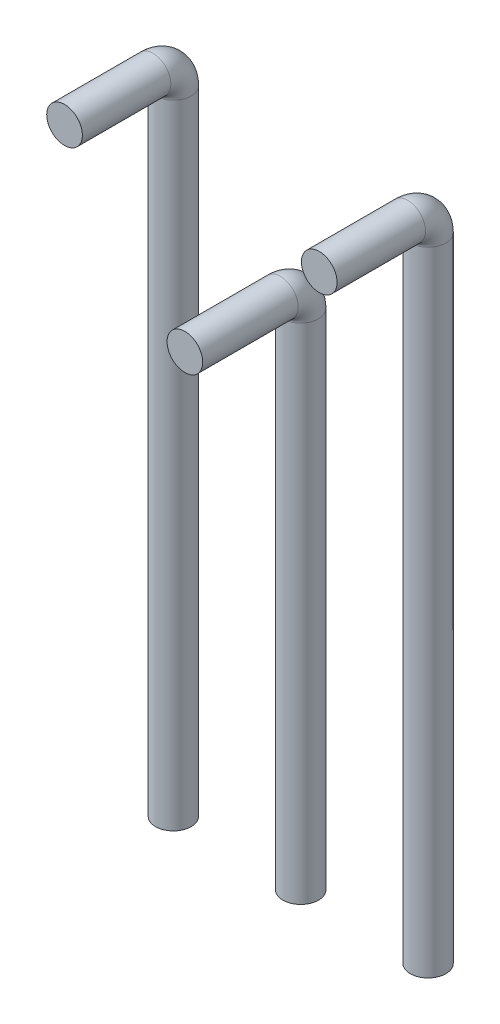
ISO-10303-21;
HEADER;
FILE_DESCRIPTION(('STEP AP214'),'2;1');
FILE_NAME('part.step','',(''),(''),'','','');
FILE_SCHEMA(('AUTOMOTIVE_DESIGN { 1 0 10303 214 1 1 1 1 }'));
ENDSEC;
DATA;
#1=APPLICATION_CONTEXT('core data for automotive mechanical design processes');
#2=APPLICATION_PROTOCOL_DEFINITION('international standard','automotive_design',2000,#1);
#3=PRODUCT_CONTEXT('',#1,'mechanical');
#4=PRODUCT('Part','Part','',(#3));
#5=PRODUCT_RELATED_PRODUCT_CATEGORY('part','',(#4));
#6=PRODUCT_DEFINITION_FORMATION('','',#4);
#7=PRODUCT_DEFINITION_CONTEXT('part definition',#1,'design');
#8=PRODUCT_DEFINITION('design','',#6,#7);
#9=PRODUCT_DEFINITION_SHAPE('','',#8);
#10=(LENGTH_UNIT() NAMED_UNIT(*) SI_UNIT(.MILLI.,.METRE.));
#11=(NAMED_UNIT(*) PLANE_ANGLE_UNIT() SI_UNIT($,.RADIAN.));
#12=(NAMED_UNIT(*) SI_UNIT($,.STERADIAN.) SOLID_ANGLE_UNIT());
#13=UNCERTAINTY_MEASURE_WITH_UNIT(LENGTH_MEASURE(1.E-05),#10,'distance_accuracy_value','');
#14=(GEOMETRIC_REPRESENTATION_CONTEXT(3) GLOBAL_UNCERTAINTY_ASSIGNED_CONTEXT((#13)) GLOBAL_UNIT_ASSIGNED_CONTEXT((#10,
#11,#12)) REPRESENTATION_CONTEXT('',''));
#15=CARTESIAN_POINT('',(0.,0.,0.));
#16=DIRECTION('',(0.,0.,1.));
#17=DIRECTION('',(1.,0.,0.));
#18=AXIS2_PLACEMENT_3D('',#15,#16,#17);
#19=CARTESIAN_POINT('',(6.86201683385187,10.2829242955665,7.09877555641469));
#20=DIRECTION('',(0.,0.,1.));
#21=DIRECTION('',(0.,-1.,0.));
#22=AXIS2_PLACEMENT_3D('',#19,#20,#21);
#23=PLANE('',#22);
#24=CARTESIAN_POINT('',(6.86201683385187,10.2829242955665,7.09877555641469));
#25=DIRECTION('',(0.,0.,1.));
#26=DIRECTION('',(1.,0.,0.));
#27=AXIS2_PLACEMENT_3D('',#24,#25,#26);
#28=CIRCLE('',#27,0.35);
#29=CARTESIAN_POINT('',(7.21201683385187,10.2829242955665,7.09877555641469));
#30=VERTEX_POINT('',#29);
#31=EDGE_CURVE('P0_E18',#30,#30,#28,.F.);
#32=ORIENTED_EDGE('',*,*,#31,.F.);
#33=EDGE_LOOP('',(#32));
#34=FACE_BOUND('',#33,.T.);
#35=ADVANCED_FACE('P0_F15',(#34),#23,.T.);
#36=CARTESIAN_POINT('',(6.86201683385187,10.2829242955665,5.22439905457059));
#37=DIRECTION('',(0.,0.,1.));
#38=DIRECTION('',(1.,0.,0.));
#39=AXIS2_PLACEMENT_3D('',#36,#37,#38);
#40=CYLINDRICAL_SURFACE('',#39,0.35);
#41=CARTESIAN_POINT('',(6.86201683385187,10.2829242955665,5.22439905457059));
#42=DIRECTION('',(0.,0.,1.));
#43=DIRECTION('',(0.,1.,0.));
#44=AXIS2_PLACEMENT_3D('',#41,#42,#43);
#45=CIRCLE('',#44,0.35);
#46=CARTESIAN_POINT('',(6.86201683385187,10.6329242955665,5.22439905457059));
#47=VERTEX_POINT('',#46);
#48=EDGE_CURVE('P0_E26',#47,#47,#45,.F.);
#49=ORIENTED_EDGE('',*,*,#48,.F.);
#50=EDGE_LOOP('',(#49));
#51=FACE_BOUND('',#50,.T.);
#52=ORIENTED_EDGE('',*,*,#31,.T.);
#53=EDGE_LOOP('',(#52));
#54=FACE_BOUND('',#53,.T.);
#55=ADVANCED_FACE('P0_F37',(#51,#54),#40,.T.);
#56=CARTESIAN_POINT('',(6.86201683385187,9.88292429556653,5.22439905457059));
#57=DIRECTION('',(1.,0.,0.));
#58=DIRECTION('',(0.,0.,-1.));
#59=AXIS2_PLACEMENT_3D('',#56,#57,#58);
#60=TOROIDAL_SURFACE('',#59,0.4,0.35);
#61=ORIENTED_EDGE('',*,*,#48,.T.);
#62=EDGE_LOOP('',(#61));
#63=FACE_BOUND('',#62,.T.);
#64=CARTESIAN_POINT('',(6.86201683385187,9.88292429556652,4.82439905457059));
#65=DIRECTION('',(0.,-1.,0.));
#66=DIRECTION('',(0.,0.,-1.));
#67=AXIS2_PLACEMENT_3D('',#64,#65,#66);
#68=CIRCLE('',#67,0.35);
#69=CARTESIAN_POINT('',(6.86201683385187,9.88292429556652,4.47439905457059));
#70=VERTEX_POINT('',#69);
#71=EDGE_CURVE('P0_E22',#70,#70,#68,.T.);
#72=ORIENTED_EDGE('',*,*,#71,.F.);
#73=EDGE_LOOP('',(#72));
#74=FACE_BOUND('',#73,.T.);
#75=ADVANCED_FACE('P0_F33',(#63,#74),#60,.T.);
#76=CARTESIAN_POINT('',(6.86201683385187,0.,4.82439905457059));
#77=DIRECTION('',(0.,1.,0.));
#78=DIRECTION('',(0.,0.,1.));
#79=AXIS2_PLACEMENT_3D('',#76,#77,#78);
#80=PLANE('',#79);
#81=CARTESIAN_POINT('',(6.86201683385187,0.,4.82439905457059));
#82=DIRECTION('',(0.,-1.,0.));
#83=DIRECTION('',(0.,0.,-1.));
#84=AXIS2_PLACEMENT_3D('',#81,#82,#83);
#85=CIRCLE('',#84,0.35);
#86=CARTESIAN_POINT('',(6.86201683385187,0.,4.47439905457059));
#87=VERTEX_POINT('',#86);
#88=EDGE_CURVE('P0_E10',#87,#87,#85,.F.);
#89=ORIENTED_EDGE('',*,*,#88,.F.);
#90=EDGE_LOOP('',(#89));
#91=FACE_BOUND('',#90,.T.);
#92=ADVANCED_FACE('P0_F36',(#91),#80,.F.);
#93=CARTESIAN_POINT('',(6.86201683385187,4.91650867562043,4.82439905457059));
#94=DIRECTION('',(0.,-1.,0.));
#95=DIRECTION('',(0.,0.,-1.));
#96=AXIS2_PLACEMENT_3D('',#93,#94,#95);
#97=CYLINDRICAL_SURFACE('',#96,0.35);
#98=ORIENTED_EDGE('',*,*,#88,.T.);
#99=EDGE_LOOP('',(#98));
#100=FACE_BOUND('',#99,.T.);
#101=ORIENTED_EDGE('',*,*,#71,.T.);
#102=EDGE_LOOP('',(#101));
#103=FACE_BOUND('',#102,.T.);
#104=ADVANCED_FACE('P0_F49',(#100,#103),#97,.T.);
#105=CLOSED_SHELL('',(#35,#55,#75,#92,#104));
#106=MANIFOLD_SOLID_BREP('P0_B1',#105);
#107=CARTESIAN_POINT('',(4.36201683385183,12.8229242955666,6.96081396231212));
#108=DIRECTION('',(0.,0.,1.));
#109=DIRECTION('',(0.,-1.,0.));
#110=AXIS2_PLACEMENT_3D('',#107,#108,#109);
#111=PLANE('',#110);
#112=CARTESIAN_POINT('',(4.36201683385183,12.8229242955666,6.96081396231212));
#113=DIRECTION('',(0.,0.,1.));
#114=DIRECTION('',(0.,-1.,0.));
#115=AXIS2_PLACEMENT_3D('',#112,#113,#114);
#116=CIRCLE('',#115,0.35);
#117=CARTESIAN_POINT('',(4.36201683385183,12.4729242955666,6.96081396231212));
#118=VERTEX_POINT('',#117);
#119=EDGE_CURVE('P1_E18',#118,#118,#116,.F.);
#120=ORIENTED_EDGE('',*,*,#119,.F.);
#121=EDGE_LOOP('',(#120));
#122=FACE_BOUND('',#121,.T.);
#123=ADVANCED_FACE('P1_F15',(#122),#111,.T.);
#124=CARTESIAN_POINT('',(4.36201683385183,12.8229242955665,5.22439905457058));
#125=DIRECTION('',(0.,0.,1.));
#126=DIRECTION('',(0.,-1.,0.));
#127=AXIS2_PLACEMENT_3D('',#124,#125,#126);
#128=CYLINDRICAL_SURFACE('',#127,0.35);
#129=ORIENTED_EDGE('',*,*,#119,.T.);
#130=EDGE_LOOP('',(#129));
#131=FACE_BOUND('',#130,.T.);
#132=CARTESIAN_POINT('',(4.36201683385183,12.8229242955665,5.22439905457058));
#133=DIRECTION('',(0.,0.,1.));
#134=DIRECTION('',(0.,1.,0.));
#135=AXIS2_PLACEMENT_3D('',#132,#133,#134);
#136=CIRCLE('',#135,0.35);
#137=CARTESIAN_POINT('',(4.36201683385183,13.1729242955665,5.22439905457057));
#138=VERTEX_POINT('',#137);
#139=EDGE_CURVE('P1_E26',#138,#138,#136,.F.);
#140=ORIENTED_EDGE('',*,*,#139,.F.);
#141=EDGE_LOOP('',(#140));
#142=FACE_BOUND('',#141,.T.);
#143=ADVANCED_FACE('P1_F37',(#131,#142),#128,.T.);
#144=CARTESIAN_POINT('',(4.36201683385183,12.4229242955665,5.22439905457059));
#145=DIRECTION('',(1.,0.,0.));
#146=DIRECTION('',(0.,0.,-1.));
#147=AXIS2_PLACEMENT_3D('',#144,#145,#146);
#148=TOROIDAL_SURFACE('',#147,0.400000000000002,0.35);
#149=ORIENTED_EDGE('',*,*,#139,.T.);
#150=EDGE_LOOP('',(#149));
#151=FACE_BOUND('',#150,.T.);
#152=CARTESIAN_POINT('',(4.36201683385183,12.4229242955665,4.82439905457059));
#153=DIRECTION('',(0.,-1.,0.));
#154=DIRECTION('',(0.,0.,-1.));
#155=AXIS2_PLACEMENT_3D('',#152,#153,#154);
#156=CIRCLE('',#155,0.35);
#157=CARTESIAN_POINT('',(4.36201683385183,12.4229242955665,4.47439905457059));
#158=VERTEX_POINT('',#157);
#159=EDGE_CURVE('P1_E22',#158,#158,#156,.T.);
#160=ORIENTED_EDGE('',*,*,#159,.F.);
#161=EDGE_LOOP('',(#160));
#162=FACE_BOUND('',#161,.T.);
#163=ADVANCED_FACE('P1_F33',(#151,#162),#148,.T.);
#164=CARTESIAN_POINT('',(4.36201683385183,0.,4.82439905457059));
#165=DIRECTION('',(0.,1.,0.));
#166=DIRECTION('',(0.,0.,1.));
#167=AXIS2_PLACEMENT_3D('',#164,#165,#166);
#168=PLANE('',#167);
#169=CARTESIAN_POINT('',(4.36201683385183,0.,4.82439905457059));
#170=DIRECTION('',(0.,-1.,0.));
#171=DIRECTION('',(0.,0.,-1.));
#172=AXIS2_PLACEMENT_3D('',#169,#170,#171);
#173=CIRCLE('',#172,0.35);
#174=CARTESIAN_POINT('',(4.36201683385183,0.,4.47439905457059));
#175=VERTEX_POINT('',#174);
#176=EDGE_CURVE('P1_E10',#175,#175,#173,.F.);
#177=ORIENTED_EDGE('',*,*,#176,.F.);
#178=EDGE_LOOP('',(#177));
#179=FACE_BOUND('',#178,.T.);
#180=ADVANCED_FACE('P1_F36',(#179),#168,.F.);
#181=CARTESIAN_POINT('',(4.36201683385183,1.80499228054032,4.82439905457059));
#182=DIRECTION('',(0.,-1.,0.));
#183=DIRECTION('',(0.,0.,-1.));
#184=AXIS2_PLACEMENT_3D('',#181,#182,#183);
#185=CYLINDRICAL_SURFACE('',#184,0.35);
#186=ORIENTED_EDGE('',*,*,#176,.T.);
#187=EDGE_LOOP('',(#186));
#188=FACE_BOUND('',#187,.T.);
#189=ORIENTED_EDGE('',*,*,#159,.T.);
#190=EDGE_LOOP('',(#189));
#191=FACE_BOUND('',#190,.T.);
#192=ADVANCED_FACE('P1_F49',(#188,#191),#185,.T.);
#193=CLOSED_SHELL('',(#123,#143,#163,#180,#192));
#194=MANIFOLD_SOLID_BREP('P1_B1',#193);
#195=CARTESIAN_POINT('',(9.36201683385183,12.8229242955666,6.96081396231212));
#196=DIRECTION('',(0.,0.,1.));
#197=DIRECTION('',(0.,-1.,0.));
#198=AXIS2_PLACEMENT_3D('',#195,#196,#197);
#199=PLANE('',#198);
#200=CARTESIAN_POINT('',(9.36201683385183,12.8229242955666,6.96081396231212));
#201=DIRECTION('',(0.,0.,1.));
#202=DIRECTION('',(1.,0.,0.));
#203=AXIS2_PLACEMENT_3D('',#200,#201,#202);
#204=CIRCLE('',#203,0.35);
#205=CARTESIAN_POINT('',(9.71201683385183,12.8229242955666,6.96081396231212));
#206=VERTEX_POINT('',#205);
#207=EDGE_CURVE('P2_E17',#206,#206,#204,.F.);
#208=ORIENTED_EDGE('',*,*,#207,.F.);
#209=EDGE_LOOP('',(#208));
#210=FACE_BOUND('',#209,.T.);
#211=ADVANCED_FACE('P2_F14',(#210),#199,.T.);
#212=CARTESIAN_POINT('',(9.36201683385183,12.8229242955666,5.22439905457059));
#213=DIRECTION('',(0.,0.,1.));
#214=DIRECTION('',(1.,0.,0.));
#215=AXIS2_PLACEMENT_3D('',#212,#213,#214);
#216=CYLINDRICAL_SURFACE('',#215,0.35);
#217=CARTESIAN_POINT('',(9.36201683385183,12.8229242955666,5.22439905457059));
#218=DIRECTION('',(0.,0.,1.));
#219=DIRECTION('',(0.,1.,0.));
#220=AXIS2_PLACEMENT_3D('',#217,#218,#219);
#221=CIRCLE('',#220,0.349999999999999);
#222=CARTESIAN_POINT('',(9.36201683385183,13.1729242955666,5.22439905457059));
#223=VERTEX_POINT('',#222);
#224=EDGE_CURVE('P2_E25',#223,#223,#221,.F.);
#225=ORIENTED_EDGE('',*,*,#224,.F.);
#226=EDGE_LOOP('',(#225));
#227=FACE_BOUND('',#226,.T.);
#228=ORIENTED_EDGE('',*,*,#207,.T.);
#229=EDGE_LOOP('',(#228));
#230=FACE_BOUND('',#229,.T.);
#231=ADVANCED_FACE('P2_F36',(#227,#230),#216,.T.);
#232=CARTESIAN_POINT('',(9.36201683385183,12.4229242955666,5.22439905457059));
#233=DIRECTION('',(1.,0.,0.));
#234=DIRECTION('',(0.,0.,-1.));
#235=AXIS2_PLACEMENT_3D('',#232,#233,#234);
#236=TOROIDAL_SURFACE('',#235,0.399999999999999,0.349999999999999);
#237=ORIENTED_EDGE('',*,*,#224,.T.);
#238=EDGE_LOOP('',(#237));
#239=FACE_BOUND('',#238,.T.);
#240=CARTESIAN_POINT('',(9.36201683385183,12.4229242955666,4.82439905457059));
#241=DIRECTION('',(0.,-1.,0.));
#242=DIRECTION('',(0.,0.,-1.));
#243=AXIS2_PLACEMENT_3D('',#240,#241,#242);
#244=CIRCLE('',#243,0.349999999999999);
#245=CARTESIAN_POINT('',(9.36201683385183,12.4229242955666,4.47439905457059));
#246=VERTEX_POINT('',#245);
#247=EDGE_CURVE('P2_E21',#246,#246,#244,.T.);
#248=ORIENTED_EDGE('',*,*,#247,.F.);
#249=EDGE_LOOP('',(#248));
#250=FACE_BOUND('',#249,.T.);
#251=ADVANCED_FACE('P2_F32',(#239,#250),#236,.T.);
#252=CARTESIAN_POINT('',(9.36201683385183,0.,4.82439905457059));
#253=DIRECTION('',(0.,1.,0.));
#254=DIRECTION('',(0.,0.,1.));
#255=AXIS2_PLACEMENT_3D('',#252,#253,#254);
#256=PLANE('',#255);
#257=CARTESIAN_POINT('',(9.36201683385183,0.,4.82439905457059));
#258=DIRECTION('',(0.,-1.,0.));
#259=DIRECTION('',(0.,0.,-1.));
#260=AXIS2_PLACEMENT_3D('',#257,#258,#259);
#261=CIRCLE('',#260,0.349999999999999);
#262=CARTESIAN_POINT('',(9.36201683385183,0.,4.47439905457059));
#263=VERTEX_POINT('',#262);
#264=EDGE_CURVE('P2_E9',#263,#263,#261,.F.);
#265=ORIENTED_EDGE('',*,*,#264,.F.);
#266=EDGE_LOOP('',(#265));
#267=FACE_BOUND('',#266,.T.);
#268=ADVANCED_FACE('P2_F35',(#267),#256,.F.);
#269=CARTESIAN_POINT('',(9.36201683385183,2.61872973721651,4.82439905457059));
#270=DIRECTION('',(0.,-1.,0.));
#271=DIRECTION('',(0.,0.,-1.));
#272=AXIS2_PLACEMENT_3D('',#269,#270,#271);
#273=CYLINDRICAL_SURFACE('',#272,0.349999999999999);
#274=ORIENTED_EDGE('',*,*,#264,.T.);
#275=EDGE_LOOP('',(#274));
#276=FACE_BOUND('',#275,.T.);
#277=ORIENTED_EDGE('',*,*,#247,.T.);
#278=EDGE_LOOP('',(#277));
#279=FACE_BOUND('',#278,.T.);
#280=ADVANCED_FACE('P2_F49',(#276,#279),#273,.T.);
#281=CLOSED_SHELL('',(#211,#231,#251,#268,#280));
#282=MANIFOLD_SOLID_BREP('P2_B1',#281);
#283=ADVANCED_BREP_SHAPE_REPRESENTATION('',(#18,#106,#194,#282),#14);
#284=SHAPE_DEFINITION_REPRESENTATION(#9,#283);
ENDSEC;
END-ISO-10303-21;
